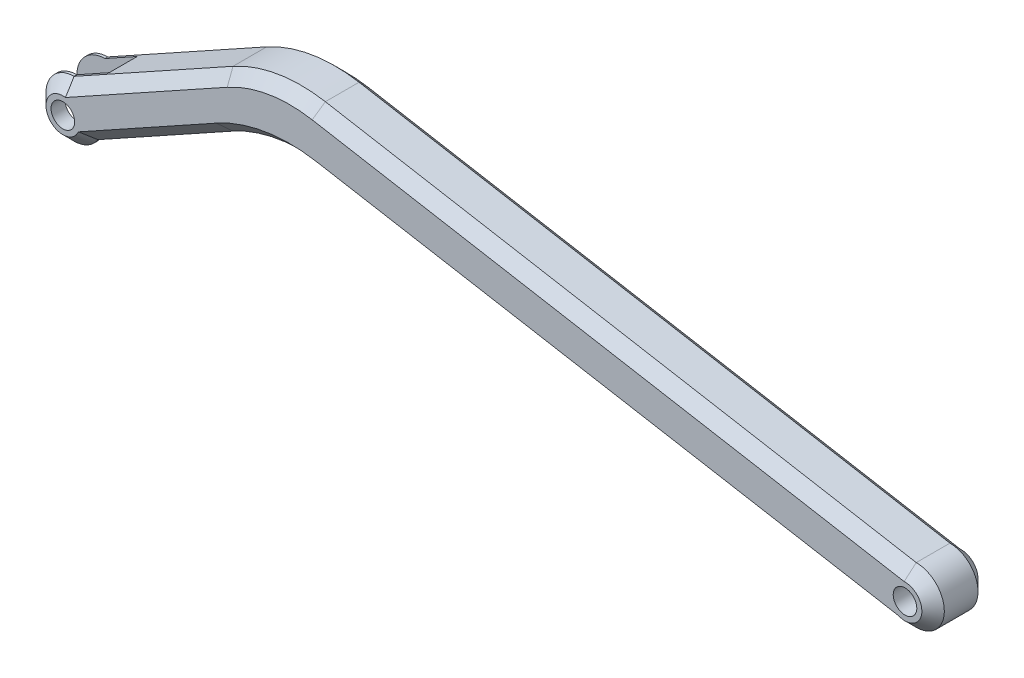
ISO-10303-21;
HEADER;
FILE_DESCRIPTION(('STEP AP214'),'2;1');
FILE_NAME('part.step','',(''),(''),'','','');
FILE_SCHEMA(('AUTOMOTIVE_DESIGN { 1 0 10303 214 1 1 1 1 }'));
ENDSEC;
DATA;
#1=APPLICATION_CONTEXT('core data for automotive mechanical design processes');
#2=APPLICATION_PROTOCOL_DEFINITION('international standard','automotive_design',2000,#1);
#3=PRODUCT_CONTEXT('',#1,'mechanical');
#4=PRODUCT('Part','Part','',(#3));
#5=PRODUCT_RELATED_PRODUCT_CATEGORY('part','',(#4));
#6=PRODUCT_DEFINITION_FORMATION('','',#4);
#7=PRODUCT_DEFINITION_CONTEXT('part definition',#1,'design');
#8=PRODUCT_DEFINITION('design','',#6,#7);
#9=PRODUCT_DEFINITION_SHAPE('','',#8);
#10=(LENGTH_UNIT() NAMED_UNIT(*) SI_UNIT(.MILLI.,.METRE.));
#11=(NAMED_UNIT(*) PLANE_ANGLE_UNIT() SI_UNIT($,.RADIAN.));
#12=(NAMED_UNIT(*) SI_UNIT($,.STERADIAN.) SOLID_ANGLE_UNIT());
#13=UNCERTAINTY_MEASURE_WITH_UNIT(LENGTH_MEASURE(1.E-05),#10,'distance_accuracy_value','');
#14=(GEOMETRIC_REPRESENTATION_CONTEXT(3) GLOBAL_UNCERTAINTY_ASSIGNED_CONTEXT((#13)) GLOBAL_UNIT_ASSIGNED_CONTEXT((#10,
#11,#12)) REPRESENTATION_CONTEXT('',''));
#15=CARTESIAN_POINT('',(0.,0.,0.));
#16=DIRECTION('',(0.,0.,1.));
#17=DIRECTION('',(1.,0.,0.));
#18=AXIS2_PLACEMENT_3D('',#15,#16,#17);
#19=CARTESIAN_POINT('',(-19.7766830177318,35.6418773630289,5.));
#20=DIRECTION('',(-0.485186186234051,0.874410867205833,0.));
#21=DIRECTION('',(-0.874410867205833,-0.485186186234051,0.));
#22=AXIS2_PLACEMENT_3D('',#19,#20,#21);
#23=PLANE('',#22);
#24=DIRECTION('',(0.,0.,-1.));
#25=VECTOR('',#24,1.);
#26=CARTESIAN_POINT('',(-75.,5.,5.));
#27=LINE('',#26,#25);
#28=CARTESIAN_POINT('',(-75.,5.,3.00000000000003));
#29=VERTEX_POINT('',#28);
#30=CARTESIAN_POINT('',(-75.,5.,2.5));
#31=VERTEX_POINT('',#30);
#32=EDGE_CURVE('E233',#29,#31,#27,.T.);
#33=ORIENTED_EDGE('',*,*,#32,.F.);
#34=DIRECTION('',(0.874410867205833,0.485186186234051,0.));
#35=VECTOR('',#34,1.);
#36=CARTESIAN_POINT('',(-19.7766830177318,35.6418773630289,3.00000000000003));
#37=LINE('',#36,#35);
#38=CARTESIAN_POINT('',(-46.6922968958502,20.7071544113314,3.00000000000003));
#39=VERTEX_POINT('',#38);
#40=EDGE_CURVE('E78',#29,#39,#37,.T.);
#41=ORIENTED_EDGE('',*,*,#40,.T.);
#42=DIRECTION('',(0.,0.,-1.));
#43=VECTOR('',#42,1.);
#44=CARTESIAN_POINT('',(-46.6922968958502,20.7071544113314,5.));
#45=LINE('',#44,#43);
#46=CARTESIAN_POINT('',(-46.6922968958502,20.7071544113314,-3.00000000000001));
#47=VERTEX_POINT('',#46);
#48=EDGE_CURVE('E235',#39,#47,#45,.T.);
#49=ORIENTED_EDGE('',*,*,#48,.T.);
#50=DIRECTION('',(-0.874410867205833,-0.485186186234051,0.));
#51=VECTOR('',#50,1.);
#52=CARTESIAN_POINT('',(-75.,5.,-3.00000000000001));
#53=LINE('',#52,#51);
#54=CARTESIAN_POINT('',(-75.,5.,-3.00000000000001));
#55=VERTEX_POINT('',#54);
#56=EDGE_CURVE('E263',#47,#55,#53,.T.);
#57=ORIENTED_EDGE('',*,*,#56,.T.);
#58=CARTESIAN_POINT('',(-75.,5.,-2.5));
#59=VERTEX_POINT('',#58);
#60=EDGE_CURVE('E214',#59,#55,#27,.T.);
#61=ORIENTED_EDGE('',*,*,#60,.F.);
#62=DIRECTION('',(-0.874410867205833,-0.485186186234051,0.));
#63=VECTOR('',#62,1.);
#64=CARTESIAN_POINT('',(-19.7766830177318,35.6418773630289,-2.5));
#65=LINE('',#64,#63);
#66=CARTESIAN_POINT('',(-69.2515625644536,8.18964749954475,-2.5));
#67=VERTEX_POINT('',#66);
#68=EDGE_CURVE('E203',#67,#59,#65,.T.);
#69=ORIENTED_EDGE('',*,*,#68,.F.);
#70=DIRECTION('',(0.,0.,-1.));
#71=VECTOR('',#70,1.);
#72=CARTESIAN_POINT('',(-69.2515625644536,8.18964749954475,5.));
#73=LINE('',#72,#71);
#74=CARTESIAN_POINT('',(-69.2515625644535,8.18964749954475,2.5));
#75=VERTEX_POINT('',#74);
#76=EDGE_CURVE('E193',#75,#67,#73,.T.);
#77=ORIENTED_EDGE('',*,*,#76,.F.);
#78=DIRECTION('',(-0.874410867205833,-0.485186186234051,0.));
#79=VECTOR('',#78,1.);
#80=CARTESIAN_POINT('',(-19.7766830177318,35.6418773630289,2.5));
#81=LINE('',#80,#79);
#82=EDGE_CURVE('E222',#75,#31,#81,.T.);
#83=ORIENTED_EDGE('',*,*,#82,.T.);
#84=EDGE_LOOP('',(#33,#41,#49,#57,#61,#69,#77,#83));
#85=FACE_BOUND('',#84,.T.);
#86=ADVANCED_FACE('F47',(#85),#23,.T.);
#87=CARTESIAN_POINT('',(-75.,0.,5.));
#88=DIRECTION('',(0.,0.,-1.));
#89=DIRECTION('',(-1.,0.,0.));
#90=AXIS2_PLACEMENT_3D('',#87,#88,#89);
#91=CYLINDRICAL_SURFACE('',#90,5.);
#92=DIRECTION('',(0.,0.,-1.));
#93=VECTOR('',#92,1.);
#94=CARTESIAN_POINT('',(-70.757479261388,-2.64594364687661,5.));
#95=LINE('',#94,#93);
#96=CARTESIAN_POINT('',(-70.757479261388,-2.64594364687661,3.00000000000003));
#97=VERTEX_POINT('',#96);
#98=CARTESIAN_POINT('',(-70.757479261388,-2.64594364687662,2.5));
#99=VERTEX_POINT('',#98);
#100=EDGE_CURVE('E231',#97,#99,#95,.T.);
#101=ORIENTED_EDGE('',*,*,#100,.F.);
#102=CARTESIAN_POINT('',(-75.,0.,3.00000000000003));
#103=DIRECTION('',(0.,0.,1.));
#104=DIRECTION('',(1.,0.,0.));
#105=AXIS2_PLACEMENT_3D('',#102,#103,#104);
#106=CIRCLE('',#105,5.);
#107=EDGE_CURVE('E485',#97,#29,#106,.F.);
#108=ORIENTED_EDGE('',*,*,#107,.T.);
#109=ORIENTED_EDGE('',*,*,#32,.T.);
#110=CARTESIAN_POINT('',(-75.,0.,2.5));
#111=DIRECTION('',(0.,0.,-1.));
#112=DIRECTION('',(-1.,0.,0.));
#113=AXIS2_PLACEMENT_3D('',#110,#111,#112);
#114=CIRCLE('',#113,5.);
#115=EDGE_CURVE('E202',#99,#31,#114,.T.);
#116=ORIENTED_EDGE('',*,*,#115,.F.);
#117=EDGE_LOOP('',(#101,#108,#109,#116));
#118=FACE_BOUND('',#117,.T.);
#119=ADVANCED_FACE('F491',(#118),#91,.T.);
#120=CARTESIAN_POINT('',(-15.5341622791197,27.9959337161523,5.));
#121=DIRECTION('',(-0.485186186234052,0.874410867205833,0.));
#122=DIRECTION('',(-0.874410867205833,-0.485186186234052,0.));
#123=AXIS2_PLACEMENT_3D('',#120,#121,#122);
#124=PLANE('',#123);
#125=DIRECTION('',(0.,0.,-1.));
#126=VECTOR('',#125,1.);
#127=CARTESIAN_POINT('',(-46.6922968958502,10.7071544113314,5.));
#128=LINE('',#127,#126);
#129=CARTESIAN_POINT('',(-46.6922968958502,10.7071544113314,3.00000000000003));
#130=VERTEX_POINT('',#129);
#131=CARTESIAN_POINT('',(-46.6922968958502,10.7071544113314,-3.00000000000001));
#132=VERTEX_POINT('',#131);
#133=EDGE_CURVE('E227',#130,#132,#128,.T.);
#134=ORIENTED_EDGE('',*,*,#133,.F.);
#135=DIRECTION('',(-0.874410867205833,-0.485186186234052,0.));
#136=VECTOR('',#135,1.);
#137=CARTESIAN_POINT('',(-70.7574792613879,-2.64594364687661,3.00000000000003));
#138=LINE('',#137,#136);
#139=EDGE_CURVE('E483',#130,#97,#138,.T.);
#140=ORIENTED_EDGE('',*,*,#139,.T.);
#141=ORIENTED_EDGE('',*,*,#100,.T.);
#142=DIRECTION('',(-0.874410867205833,-0.485186186234052,0.));
#143=VECTOR('',#142,1.);
#144=CARTESIAN_POINT('',(-15.5341622791197,27.9959337161523,2.5));
#145=LINE('',#144,#143);
#146=CARTESIAN_POINT('',(-65.0090418258415,0.543703852668149,2.5));
#147=VERTEX_POINT('',#146);
#148=EDGE_CURVE('E463',#147,#99,#145,.T.);
#149=ORIENTED_EDGE('',*,*,#148,.F.);
#150=DIRECTION('',(0.,0.,-1.));
#151=VECTOR('',#150,1.);
#152=CARTESIAN_POINT('',(-65.0090418258415,0.54370385266814,5.));
#153=LINE('',#152,#151);
#154=CARTESIAN_POINT('',(-65.0090418258415,0.543703852668144,-2.5));
#155=VERTEX_POINT('',#154);
#156=EDGE_CURVE('E631',#147,#155,#153,.T.);
#157=ORIENTED_EDGE('',*,*,#156,.T.);
#158=DIRECTION('',(-0.874410867205833,-0.485186186234052,0.));
#159=VECTOR('',#158,1.);
#160=CARTESIAN_POINT('',(-15.5341622791197,27.9959337161523,-2.5));
#161=LINE('',#160,#159);
#162=CARTESIAN_POINT('',(-70.757479261388,-2.64594364687661,-2.5));
#163=VERTEX_POINT('',#162);
#164=EDGE_CURVE('E209',#155,#163,#161,.T.);
#165=ORIENTED_EDGE('',*,*,#164,.T.);
#166=CARTESIAN_POINT('',(-70.757479261388,-2.64594364687661,-3.00000000000001));
#167=VERTEX_POINT('',#166);
#168=EDGE_CURVE('E230',#163,#167,#95,.T.);
#169=ORIENTED_EDGE('',*,*,#168,.T.);
#170=DIRECTION('',(0.874410867205833,0.485186186234052,0.));
#171=VECTOR('',#170,1.);
#172=CARTESIAN_POINT('',(-15.5341622791197,27.9959337161523,-3.00000000000001));
#173=LINE('',#172,#171);
#174=EDGE_CURVE('E280',#167,#132,#173,.T.);
#175=ORIENTED_EDGE('',*,*,#174,.T.);
#176=EDGE_LOOP('',(#134,#140,#141,#149,#157,#165,#169,#175));
#177=FACE_BOUND('',#176,.T.);
#178=ADVANCED_FACE('F577',(#177),#124,.F.);
#179=CARTESIAN_POINT('',(1.38985393390014,7.91908590447998,5.));
#180=DIRECTION('',(-0.172864709780784,-0.984945578249075,0.));
#181=DIRECTION('',(0.984945578249075,-0.172864709780784,0.));
#182=AXIS2_PLACEMENT_3D('',#179,#180,#181);
#183=PLANE('',#182);
#184=DIRECTION('',(0.,0.,-1.));
#185=VECTOR('',#184,1.);
#186=CARTESIAN_POINT('',(73.297376684661,-4.701177921124,5.));
#187=LINE('',#186,#185);
#188=CARTESIAN_POINT('',(73.297376684661,-4.701177921124,3.00000000000003));
#189=VERTEX_POINT('',#188);
#190=CARTESIAN_POINT('',(73.297376684661,-4.701177921124,-3.00000000000001));
#191=VERTEX_POINT('',#190);
#192=EDGE_CURVE('E241',#189,#191,#187,.T.);
#193=ORIENTED_EDGE('',*,*,#192,.F.);
#194=DIRECTION('',(-0.984945578249075,0.172864709780784,0.));
#195=VECTOR('',#194,1.);
#196=CARTESIAN_POINT('',(1.38985393390014,7.91908590447998,3.00000000000003));
#197=LINE('',#196,#195);
#198=CARTESIAN_POINT('',(-30.2410244954791,13.4705221874125,3.00000000000003));
#199=VERTEX_POINT('',#198);
#200=EDGE_CURVE('E479',#189,#199,#197,.T.);
#201=ORIENTED_EDGE('',*,*,#200,.T.);
#202=DIRECTION('',(0.,0.,-1.));
#203=VECTOR('',#202,1.);
#204=CARTESIAN_POINT('',(-30.2410244954791,13.4705221874125,5.));
#205=LINE('',#204,#203);
#206=CARTESIAN_POINT('',(-30.2410244954791,13.4705221874125,-3.00000000000001));
#207=VERTEX_POINT('',#206);
#208=EDGE_CURVE('E225',#199,#207,#205,.T.);
#209=ORIENTED_EDGE('',*,*,#208,.T.);
#210=DIRECTION('',(0.984945578249075,-0.172864709780784,0.));
#211=VECTOR('',#210,1.);
#212=CARTESIAN_POINT('',(73.297376684661,-4.701177921124,-3.00000000000001));
#213=LINE('',#212,#211);
#214=EDGE_CURVE('E274',#207,#191,#213,.T.);
#215=ORIENTED_EDGE('',*,*,#214,.T.);
#216=EDGE_LOOP('',(#193,#201,#209,#215));
#217=FACE_BOUND('',#216,.T.);
#218=ADVANCED_FACE('F515',(#217),#183,.T.);
#219=CARTESIAN_POINT('',(75.,0.,5.));
#220=DIRECTION('',(0.,0.,-1.));
#221=DIRECTION('',(-1.,0.,0.));
#222=AXIS2_PLACEMENT_3D('',#219,#220,#221);
#223=CYLINDRICAL_SURFACE('',#222,5.);
#224=DIRECTION('',(0.,0.,-1.));
#225=VECTOR('',#224,1.);
#226=CARTESIAN_POINT('',(75.,5.00000000000003,5.));
#227=LINE('',#226,#225);
#228=CARTESIAN_POINT('',(75.,5.00000000000003,3.00000000000003));
#229=VERTEX_POINT('',#228);
#230=CARTESIAN_POINT('',(75.,5.00000000000003,-3.00000000000001));
#231=VERTEX_POINT('',#230);
#232=EDGE_CURVE('E239',#229,#231,#227,.T.);
#233=ORIENTED_EDGE('',*,*,#232,.F.);
#234=CARTESIAN_POINT('',(75.,0.,3.00000000000003));
#235=DIRECTION('',(0.,0.,1.));
#236=DIRECTION('',(1.,0.,0.));
#237=AXIS2_PLACEMENT_3D('',#234,#235,#236);
#238=CIRCLE('',#237,5.);
#239=EDGE_CURVE('E476',#229,#189,#238,.F.);
#240=ORIENTED_EDGE('',*,*,#239,.T.);
#241=ORIENTED_EDGE('',*,*,#192,.T.);
#242=CARTESIAN_POINT('',(75.,0.,-3.00000000000001));
#243=DIRECTION('',(0.,0.,1.));
#244=DIRECTION('',(1.,0.,0.));
#245=AXIS2_PLACEMENT_3D('',#242,#243,#244);
#246=CIRCLE('',#245,5.);
#247=EDGE_CURVE('E271',#191,#231,#246,.T.);
#248=ORIENTED_EDGE('',*,*,#247,.T.);
#249=EDGE_LOOP('',(#233,#240,#241,#248));
#250=FACE_BOUND('',#249,.T.);
#251=ADVANCED_FACE('F513',(#250),#223,.T.);
#252=CARTESIAN_POINT('',(3.09247724923907,17.620263825604,5.));
#253=DIRECTION('',(-0.172864709780784,-0.984945578249075,0.));
#254=DIRECTION('',(0.984945578249075,-0.172864709780784,0.));
#255=AXIS2_PLACEMENT_3D('',#252,#253,#254);
#256=PLANE('',#255);
#257=DIRECTION('',(0.,0.,-1.));
#258=VECTOR('',#257,1.);
#259=CARTESIAN_POINT('',(-30.2410244954792,23.4705221874125,5.));
#260=LINE('',#259,#258);
#261=CARTESIAN_POINT('',(-30.2410244954792,23.4705221874125,3.00000000000003));
#262=VERTEX_POINT('',#261);
#263=CARTESIAN_POINT('',(-30.2410244954792,23.4705221874125,-3.00000000000001));
#264=VERTEX_POINT('',#263);
#265=EDGE_CURVE('E237',#262,#264,#260,.T.);
#266=ORIENTED_EDGE('',*,*,#265,.F.);
#267=DIRECTION('',(0.984945578249075,-0.172864709780784,0.));
#268=VECTOR('',#267,1.);
#269=CARTESIAN_POINT('',(75.,5.00000000000003,3.00000000000003));
#270=LINE('',#269,#268);
#271=EDGE_CURVE('E11',#262,#229,#270,.T.);
#272=ORIENTED_EDGE('',*,*,#271,.T.);
#273=ORIENTED_EDGE('',*,*,#232,.T.);
#274=DIRECTION('',(-0.984945578249075,0.172864709780784,0.));
#275=VECTOR('',#274,1.);
#276=CARTESIAN_POINT('',(3.09247724923907,17.620263825604,-3.00000000000001));
#277=LINE('',#276,#275);
#278=EDGE_CURVE('E268',#231,#264,#277,.T.);
#279=ORIENTED_EDGE('',*,*,#278,.T.);
#280=EDGE_LOOP('',(#266,#272,#273,#279));
#281=FACE_BOUND('',#280,.T.);
#282=ADVANCED_FACE('F562',(#281),#256,.F.);
#283=CARTESIAN_POINT('',(-34.5626422399989,-1.15311726881433,5.));
#284=DIRECTION('',(0.,0.,-1.));
#285=DIRECTION('',(-1.,0.,0.));
#286=AXIS2_PLACEMENT_3D('',#283,#284,#285);
#287=CYLINDRICAL_SURFACE('',#286,25.);
#288=ORIENTED_EDGE('',*,*,#48,.F.);
#289=CARTESIAN_POINT('',(-34.5626422399989,-1.15311726881433,3.00000000000003));
#290=DIRECTION('',(0.,0.,1.));
#291=DIRECTION('',(1.,0.,0.));
#292=AXIS2_PLACEMENT_3D('',#289,#290,#291);
#293=CIRCLE('',#292,25.);
#294=EDGE_CURVE('E63',#39,#262,#293,.F.);
#295=ORIENTED_EDGE('',*,*,#294,.T.);
#296=ORIENTED_EDGE('',*,*,#265,.T.);
#297=CARTESIAN_POINT('',(-34.5626422399989,-1.15311726881433,-3.00000000000001));
#298=DIRECTION('',(0.,0.,1.));
#299=DIRECTION('',(1.,0.,0.));
#300=AXIS2_PLACEMENT_3D('',#297,#298,#299);
#301=CIRCLE('',#300,25.);
#302=EDGE_CURVE('E265',#264,#47,#301,.T.);
#303=ORIENTED_EDGE('',*,*,#302,.T.);
#304=EDGE_LOOP('',(#288,#295,#296,#303));
#305=FACE_BOUND('',#304,.T.);
#306=ADVANCED_FACE('F559',(#305),#287,.T.);
#307=ORIENTED_EDGE('',*,*,#168,.F.);
#308=CARTESIAN_POINT('',(-75.,0.,-2.5));
#309=DIRECTION('',(0.,0.,-1.));
#310=DIRECTION('',(-1.,0.,0.));
#311=AXIS2_PLACEMENT_3D('',#308,#309,#310);
#312=CIRCLE('',#311,5.);
#313=EDGE_CURVE('E215',#163,#59,#312,.T.);
#314=ORIENTED_EDGE('',*,*,#313,.T.);
#315=ORIENTED_EDGE('',*,*,#60,.T.);
#316=CARTESIAN_POINT('',(-75.,0.,-3.00000000000001));
#317=DIRECTION('',(0.,0.,1.));
#318=DIRECTION('',(1.,0.,0.));
#319=AXIS2_PLACEMENT_3D('',#316,#317,#318);
#320=CIRCLE('',#319,5.);
#321=EDGE_CURVE('E243',#55,#167,#320,.T.);
#322=ORIENTED_EDGE('',*,*,#321,.T.);
#323=EDGE_LOOP('',(#307,#314,#315,#322));
#324=FACE_BOUND('',#323,.T.);
#325=ADVANCED_FACE('F558',(#324),#91,.T.);
#326=CARTESIAN_POINT('',(-34.5626422399988,-11.1531172688143,5.));
#327=DIRECTION('',(0.,0.,-1.));
#328=DIRECTION('',(-1.,0.,0.));
#329=AXIS2_PLACEMENT_3D('',#326,#327,#328);
#330=CYLINDRICAL_SURFACE('',#329,25.);
#331=ORIENTED_EDGE('',*,*,#208,.F.);
#332=CARTESIAN_POINT('',(-34.5626422399988,-11.1531172688143,3.00000000000003));
#333=DIRECTION('',(0.,0.,1.));
#334=DIRECTION('',(1.,0.,0.));
#335=AXIS2_PLACEMENT_3D('',#332,#333,#334);
#336=CIRCLE('',#335,25.);
#337=EDGE_CURVE('E481',#199,#130,#336,.T.);
#338=ORIENTED_EDGE('',*,*,#337,.T.);
#339=ORIENTED_EDGE('',*,*,#133,.T.);
#340=CARTESIAN_POINT('',(-34.5626422399988,-11.1531172688143,-3.00000000000001));
#341=DIRECTION('',(0.,0.,1.));
#342=DIRECTION('',(1.,0.,0.));
#343=AXIS2_PLACEMENT_3D('',#340,#341,#342);
#344=CIRCLE('',#343,25.);
#345=EDGE_CURVE('E277',#132,#207,#344,.F.);
#346=ORIENTED_EDGE('',*,*,#345,.T.);
#347=EDGE_LOOP('',(#331,#338,#339,#346));
#348=FACE_BOUND('',#347,.T.);
#349=ADVANCED_FACE('F581',(#348),#330,.F.);
#350=CARTESIAN_POINT('',(0.,0.,5.));
#351=DIRECTION('',(0.,0.,1.));
#352=DIRECTION('',(1.,0.,0.));
#353=AXIS2_PLACEMENT_3D('',#350,#351,#352);
#354=PLANE('',#353);
#355=DIRECTION('',(0.984945578249075,-0.172864709780784,0.));
#356=VECTOR('',#355,1.);
#357=CARTESIAN_POINT('',(1.73558335346171,9.8889770609781,5.));
#358=LINE('',#357,#356);
#359=CARTESIAN_POINT('',(-29.8952950759175,15.4404133439107,5.));
#360=VERTEX_POINT('',#359);
#361=CARTESIAN_POINT('',(73.8366637876181,-2.7652574666676,5.));
#362=VERTEX_POINT('',#361);
#363=EDGE_CURVE('E472',#360,#362,#358,.T.);
#364=ORIENTED_EDGE('',*,*,#363,.T.);
#365=CARTESIAN_POINT('',(75.,0.,5.));
#366=DIRECTION('',(0.,0.,1.));
#367=DIRECTION('',(1.,0.,0.));
#368=AXIS2_PLACEMENT_3D('',#365,#366,#367);
#369=CIRCLE('',#368,3.00000000000003);
#370=CARTESIAN_POINT('',(74.8478282638338,2.99613814146019,5.));
#371=VERTEX_POINT('',#370);
#372=EDGE_CURVE('E474',#362,#371,#369,.T.);
#373=ORIENTED_EDGE('',*,*,#372,.T.);
#374=DIRECTION('',(-0.984945578249075,0.172864709780784,0.));
#375=VECTOR('',#374,1.);
#376=CARTESIAN_POINT('',(-30.5867539150407,21.5006310309144,5.));
#377=LINE('',#376,#375);
#378=CARTESIAN_POINT('',(-30.5867539150407,21.5006310309144,5.));
#379=VERTEX_POINT('',#378);
#380=EDGE_CURVE('E452',#371,#379,#377,.T.);
#381=ORIENTED_EDGE('',*,*,#380,.T.);
#382=CARTESIAN_POINT('',(-34.5626422399989,-1.15311726881433,5.));
#383=DIRECTION('',(0.,0.,1.));
#384=DIRECTION('',(1.,0.,0.));
#385=AXIS2_PLACEMENT_3D('',#382,#383,#384);
#386=CIRCLE('',#385,23.);
#387=CARTESIAN_POINT('',(-45.7219245233821,18.9583326769198,5.));
#388=VERTEX_POINT('',#387);
#389=EDGE_CURVE('E455',#379,#388,#386,.T.);
#390=ORIENTED_EDGE('',*,*,#389,.T.);
#391=DIRECTION('',(-0.874410867205833,-0.485186186234051,0.));
#392=VECTOR('',#391,1.);
#393=CARTESIAN_POINT('',(-18.8063106452637,33.8930556286172,5.));
#394=LINE('',#393,#392);
#395=CARTESIAN_POINT('',(-74.5448834232517,2.96527720484429,5.));
#396=VERTEX_POINT('',#395);
#397=EDGE_CURVE('E459',#388,#396,#394,.T.);
#398=ORIENTED_EDGE('',*,*,#397,.T.);
#399=CARTESIAN_POINT('',(-75.,0.,5.));
#400=DIRECTION('',(0.,0.,1.));
#401=DIRECTION('',(1.,0.,0.));
#402=AXIS2_PLACEMENT_3D('',#399,#400,#401);
#403=CIRCLE('',#402,3.00000000000003);
#404=CARTESIAN_POINT('',(-72.2431074295759,-1.18302297320905,5.));
#405=VERTEX_POINT('',#404);
#406=EDGE_CURVE('E461',#396,#405,#403,.T.);
#407=ORIENTED_EDGE('',*,*,#406,.T.);
#408=DIRECTION('',(0.874410867205833,0.485186186234052,0.));
#409=VECTOR('',#408,1.);
#410=CARTESIAN_POINT('',(-47.6626692683183,12.4559761457431,5.));
#411=LINE('',#410,#409);
#412=CARTESIAN_POINT('',(-47.6626692683183,12.4559761457431,5.));
#413=VERTEX_POINT('',#412);
#414=EDGE_CURVE('E468',#405,#413,#411,.T.);
#415=ORIENTED_EDGE('',*,*,#414,.T.);
#416=CARTESIAN_POINT('',(-34.5626422399988,-11.1531172688143,5.));
#417=DIRECTION('',(0.,0.,1.));
#418=DIRECTION('',(1.,0.,0.));
#419=AXIS2_PLACEMENT_3D('',#416,#417,#418);
#420=CIRCLE('',#419,27.);
#421=EDGE_CURVE('E470',#413,#360,#420,.F.);
#422=ORIENTED_EDGE('',*,*,#421,.T.);
#423=EDGE_LOOP('',(#364,#373,#381,#390,#398,#407,#415,#422));
#424=FACE_BOUND('',#423,.T.);
#425=CARTESIAN_POINT('',(-75.,0.,5.));
#426=DIRECTION('',(0.,0.,1.));
#427=DIRECTION('',(1.,0.,0.));
#428=AXIS2_PLACEMENT_3D('',#425,#426,#427);
#429=CIRCLE('',#428,2.1);
#430=CARTESIAN_POINT('',(-72.9,0.,5.));
#431=VERTEX_POINT('',#430);
#432=EDGE_CURVE('E616',#431,#431,#429,.T.);
#433=ORIENTED_EDGE('',*,*,#432,.F.);
#434=EDGE_LOOP('',(#433));
#435=FACE_BOUND('',#434,.T.);
#436=CARTESIAN_POINT('',(75.,0.,5.));
#437=DIRECTION('',(0.,0.,1.));
#438=DIRECTION('',(1.,0.,0.));
#439=AXIS2_PLACEMENT_3D('',#436,#437,#438);
#440=CIRCLE('',#439,2.1);
#441=CARTESIAN_POINT('',(77.1,0.,5.));
#442=VERTEX_POINT('',#441);
#443=EDGE_CURVE('E618',#442,#442,#440,.T.);
#444=ORIENTED_EDGE('',*,*,#443,.F.);
#445=EDGE_LOOP('',(#444));
#446=FACE_BOUND('',#445,.T.);
#447=ADVANCED_FACE('F498',(#424,#435,#446),#354,.T.);
#448=CARTESIAN_POINT('',(0.,0.,-5.));
#449=DIRECTION('',(0.,0.,1.));
#450=DIRECTION('',(1.,0.,0.));
#451=AXIS2_PLACEMENT_3D('',#448,#449,#450);
#452=PLANE('',#451);
#453=CARTESIAN_POINT('',(-75.,0.,-5.));
#454=DIRECTION('',(0.,0.,1.));
#455=DIRECTION('',(1.,0.,0.));
#456=AXIS2_PLACEMENT_3D('',#453,#454,#455);
#457=CIRCLE('',#456,2.1);
#458=CARTESIAN_POINT('',(-72.9,0.,-5.));
#459=VERTEX_POINT('',#458);
#460=EDGE_CURVE('E617',#459,#459,#457,.T.);
#461=ORIENTED_EDGE('',*,*,#460,.T.);
#462=EDGE_LOOP('',(#461));
#463=FACE_BOUND('',#462,.T.);
#464=CARTESIAN_POINT('',(75.,0.,-5.));
#465=DIRECTION('',(0.,0.,1.));
#466=DIRECTION('',(1.,0.,0.));
#467=AXIS2_PLACEMENT_3D('',#464,#465,#466);
#468=CIRCLE('',#467,2.1);
#469=CARTESIAN_POINT('',(77.1,0.,-5.));
#470=VERTEX_POINT('',#469);
#471=EDGE_CURVE('E504',#470,#470,#468,.T.);
#472=ORIENTED_EDGE('',*,*,#471,.T.);
#473=EDGE_LOOP('',(#472));
#474=FACE_BOUND('',#473,.T.);
#475=DIRECTION('',(-0.874410867205833,-0.485186186234052,0.));
#476=VECTOR('',#475,1.);
#477=CARTESIAN_POINT('',(-16.5045346515878,29.7447554505639,-5.));
#478=LINE('',#477,#476);
#479=CARTESIAN_POINT('',(-47.6626692683183,12.4559761457431,-5.));
#480=VERTEX_POINT('',#479);
#481=CARTESIAN_POINT('',(-72.2431074295759,-1.18302297320902,-5.));
#482=VERTEX_POINT('',#481);
#483=EDGE_CURVE('E246',#480,#482,#478,.T.);
#484=ORIENTED_EDGE('',*,*,#483,.T.);
#485=CARTESIAN_POINT('',(-75.,0.,-5.));
#486=DIRECTION('',(0.,0.,1.));
#487=DIRECTION('',(1.,0.,0.));
#488=AXIS2_PLACEMENT_3D('',#485,#486,#487);
#489=CIRCLE('',#488,3.00000000000001);
#490=CARTESIAN_POINT('',(-74.5448834232517,2.96527720484426,-5.));
#491=VERTEX_POINT('',#490);
#492=EDGE_CURVE('E260',#482,#491,#489,.F.);
#493=ORIENTED_EDGE('',*,*,#492,.T.);
#494=DIRECTION('',(0.874410867205833,0.485186186234051,0.));
#495=VECTOR('',#494,1.);
#496=CARTESIAN_POINT('',(-45.7219245233821,18.9583326769198,-5.));
#497=LINE('',#496,#495);
#498=CARTESIAN_POINT('',(-45.7219245233821,18.9583326769198,-5.));
#499=VERTEX_POINT('',#498);
#500=EDGE_CURVE('E258',#491,#499,#497,.T.);
#501=ORIENTED_EDGE('',*,*,#500,.T.);
#502=CARTESIAN_POINT('',(-34.5626422399989,-1.15311726881433,-5.));
#503=DIRECTION('',(0.,0.,1.));
#504=DIRECTION('',(1.,0.,0.));
#505=AXIS2_PLACEMENT_3D('',#502,#503,#504);
#506=CIRCLE('',#505,23.);
#507=CARTESIAN_POINT('',(-30.5867539150407,21.5006310309144,-5.));
#508=VERTEX_POINT('',#507);
#509=EDGE_CURVE('E256',#499,#508,#506,.F.);
#510=ORIENTED_EDGE('',*,*,#509,.T.);
#511=DIRECTION('',(0.984945578249075,-0.172864709780784,0.));
#512=VECTOR('',#511,1.);
#513=CARTESIAN_POINT('',(2.74674782967751,15.6503726691059,-5.));
#514=LINE('',#513,#512);
#515=CARTESIAN_POINT('',(74.8478282638339,2.99613814146017,-5.));
#516=VERTEX_POINT('',#515);
#517=EDGE_CURVE('E254',#508,#516,#514,.T.);
#518=ORIENTED_EDGE('',*,*,#517,.T.);
#519=CARTESIAN_POINT('',(75.,0.,-5.));
#520=DIRECTION('',(0.,0.,1.));
#521=DIRECTION('',(1.,0.,0.));
#522=AXIS2_PLACEMENT_3D('',#519,#520,#521);
#523=CIRCLE('',#522,3.);
#524=CARTESIAN_POINT('',(73.8366637876181,-2.76525746666757,-5.));
#525=VERTEX_POINT('',#524);
#526=EDGE_CURVE('E252',#516,#525,#523,.F.);
#527=ORIENTED_EDGE('',*,*,#526,.T.);
#528=DIRECTION('',(-0.984945578249075,0.172864709780784,0.));
#529=VECTOR('',#528,1.);
#530=CARTESIAN_POINT('',(-29.8952950759175,15.4404133439107,-5.));
#531=LINE('',#530,#529);
#532=CARTESIAN_POINT('',(-29.8952950759175,15.4404133439107,-5.));
#533=VERTEX_POINT('',#532);
#534=EDGE_CURVE('E250',#525,#533,#531,.T.);
#535=ORIENTED_EDGE('',*,*,#534,.T.);
#536=CARTESIAN_POINT('',(-34.5626422399988,-11.1531172688143,-5.));
#537=DIRECTION('',(0.,0.,1.));
#538=DIRECTION('',(1.,0.,0.));
#539=AXIS2_PLACEMENT_3D('',#536,#537,#538);
#540=CIRCLE('',#539,27.);
#541=EDGE_CURVE('E248',#533,#480,#540,.T.);
#542=ORIENTED_EDGE('',*,*,#541,.T.);
#543=EDGE_LOOP('',(#484,#493,#501,#510,#518,#527,#535,#542));
#544=FACE_BOUND('',#543,.T.);
#545=ADVANCED_FACE('F341',(#463,#474,#544),#452,.F.);
#546=CARTESIAN_POINT('',(75.,0.,-3.00000000000001));
#547=DIRECTION('',(0.,0.,1.));
#548=DIRECTION('',(1.,0.,0.));
#549=AXIS2_PLACEMENT_3D('',#546,#547,#548);
#550=CONICAL_SURFACE('',#549,5.,0.785398163397452);
#551=CARTESIAN_POINT('',(73.8366637876181,-2.76525746666757,-5.));
#552=CARTESIAN_POINT('',(73.7894011421171,-2.92605490443728,-4.83345323117694));
#553=CARTESIAN_POINT('',(73.7428706962458,-3.08702268315188,-4.6668652572699));
#554=CARTESIAN_POINT('',(73.6510359063852,-3.40923671797686,-4.33362697412222));
#555=CARTESIAN_POINT('',(73.6057315382489,-3.57048296853623,-4.16697666617485));
#556=CARTESIAN_POINT('',(73.5161092837704,-3.89319620795016,-3.83362916296133));
#557=CARTESIAN_POINT('',(73.4717913859556,-4.05466319421439,-3.66693196826333));
#558=CARTESIAN_POINT('',(73.3839928290359,-4.37778747637597,-3.33349486326228));
#559=CARTESIAN_POINT('',(73.3405121863303,-4.53944477593534,-3.16675495218722));
#560=CARTESIAN_POINT('',(73.297376684661,-4.701177921124,-3.00000000000001));
#561=B_SPLINE_CURVE_WITH_KNOTS('',3,(#551,#552,#553,#554,#555,#556,#557,#558,#559,#560),
.UNSPECIFIED.,.F.,.F.,(4,2,2,2,4),(0.,0.708831333942177,1.417648697562,2.12645781337638,
2.83528079860437),.UNSPECIFIED.);
#562=EDGE_CURVE('E347',#525,#191,#561,.T.);
#563=ORIENTED_EDGE('',*,*,#562,.F.);
#564=ORIENTED_EDGE('',*,*,#526,.F.);
#565=CARTESIAN_POINT('',(74.8478282638339,2.99613814146017,-5.));
#566=CARTESIAN_POINT('',(74.8581457360479,3.16341971073835,-4.83345323117694));
#567=CARTESIAN_POINT('',(74.8692096537014,3.33061210860216,-4.6668652572699));
#568=CARTESIAN_POINT('',(74.8925851420493,3.66484122075642,-4.33362697412222));
#569=CARTESIAN_POINT('',(74.9048966881493,3.83187793805028,-4.16697666617485));
#570=CARTESIAN_POINT('',(74.9305224724691,4.1658229972574,-3.83362916296133));
#571=CARTESIAN_POINT('',(74.9438366990198,4.33273134064182,-3.66693196826333));
#572=CARTESIAN_POINT('',(74.9713171588724,4.66644186287016,-3.33349486326228));
#573=CARTESIAN_POINT('',(74.9854834088406,4.83324403957283,-3.16675495218723));
#574=CARTESIAN_POINT('',(74.9999999999999,5.00000000000003,-3.00000000000001));
#575=B_SPLINE_CURVE_WITH_KNOTS('',3,(#565,#566,#567,#568,#569,#570,#571,#572,#573,#574),
.UNSPECIFIED.,.F.,.F.,(4,2,2,2,4),(0.,0.708831333942177,1.417648697562,2.12645781337638,
2.83528079860436),.UNSPECIFIED.);
#576=EDGE_CURVE('E228',#231,#516,#575,.F.);
#577=ORIENTED_EDGE('',*,*,#576,.F.);
#578=ORIENTED_EDGE('',*,*,#247,.F.);
#579=EDGE_LOOP('',(#563,#564,#577,#578));
#580=FACE_BOUND('',#579,.T.);
#581=ADVANCED_FACE('F333',(#580),#550,.T.);
#582=CARTESIAN_POINT('',(3.09247724923907,17.620263825604,-3.00000000000001));
#583=DIRECTION('',(-0.122233808513837,-0.696461697479624,0.70710678118655));
#584=DIRECTION('',(-0.984945578249075,0.172864709780784,0.));
#585=AXIS2_PLACEMENT_3D('',#582,#583,#584);
#586=PLANE('',#585);
#587=ORIENTED_EDGE('',*,*,#576,.T.);
#588=ORIENTED_EDGE('',*,*,#517,.F.);
#589=DIRECTION('',(-0.12223380851384,-0.696461697479627,-0.707106781186546));
#590=VECTOR('',#589,1.);
#591=CARTESIAN_POINT('',(-30.2410244954792,23.4705221874125,-3.00000000000001));
#592=LINE('',#591,#590);
#593=EDGE_CURVE('E528',#264,#508,#592,.T.);
#594=ORIENTED_EDGE('',*,*,#593,.F.);
#595=ORIENTED_EDGE('',*,*,#278,.F.);
#596=EDGE_LOOP('',(#587,#588,#594,#595));
#597=FACE_BOUND('',#596,.T.);
#598=ADVANCED_FACE('F340',(#597),#586,.F.);
#599=CARTESIAN_POINT('',(1.73558335346171,9.88897706097813,-5.));
#600=DIRECTION('',(-0.122233808513836,-0.696461697479624,-0.70710678118655));
#601=DIRECTION('',(0.984945578249075,-0.172864709780784,0.));
#602=AXIS2_PLACEMENT_3D('',#599,#600,#601);
#603=PLANE('',#602);
#604=ORIENTED_EDGE('',*,*,#562,.T.);
#605=ORIENTED_EDGE('',*,*,#214,.F.);
#606=DIRECTION('',(-0.122233808513837,-0.696461697479628,0.707106781186545));
#607=VECTOR('',#606,1.);
#608=CARTESIAN_POINT('',(-29.8952950759175,15.4404133439107,-5.));
#609=LINE('',#608,#607);
#610=EDGE_CURVE('E530',#533,#207,#609,.T.);
#611=ORIENTED_EDGE('',*,*,#610,.F.);
#612=ORIENTED_EDGE('',*,*,#534,.F.);
#613=EDGE_LOOP('',(#604,#605,#611,#612));
#614=FACE_BOUND('',#613,.T.);
#615=ADVANCED_FACE('F331',(#614),#603,.T.);
#616=CARTESIAN_POINT('',(-34.5626422399989,-1.15311726881433,-3.00000000000001));
#617=DIRECTION('',(0.,0.,1.));
#618=DIRECTION('',(1.,0.,0.));
#619=AXIS2_PLACEMENT_3D('',#616,#617,#618);
#620=CONICAL_SURFACE('',#619,25.,0.785398163397452);
#621=ORIENTED_EDGE('',*,*,#593,.T.);
#622=ORIENTED_EDGE('',*,*,#509,.F.);
#623=DIRECTION('',(0.343078442424138,-0.618301853744456,-0.707106781186546));
#624=VECTOR('',#623,1.);
#625=CARTESIAN_POINT('',(-46.6922968958502,20.7071544113314,-3.00000000000001));
#626=LINE('',#625,#624);
#627=EDGE_CURVE('E534',#47,#499,#626,.T.);
#628=ORIENTED_EDGE('',*,*,#627,.F.);
#629=ORIENTED_EDGE('',*,*,#302,.F.);
#630=EDGE_LOOP('',(#621,#622,#628,#629));
#631=FACE_BOUND('',#630,.T.);
#632=ADVANCED_FACE('F324',(#631),#620,.T.);
#633=CARTESIAN_POINT('',(-34.5626422399988,-11.1531172688143,-5.));
#634=DIRECTION('',(0.,0.,-1.));
#635=DIRECTION('',(-1.,0.,0.));
#636=AXIS2_PLACEMENT_3D('',#633,#634,#635);
#637=CONICAL_SURFACE('',#636,27.,0.785398163397451);
#638=ORIENTED_EDGE('',*,*,#610,.T.);
#639=ORIENTED_EDGE('',*,*,#345,.F.);
#640=DIRECTION('',(0.34307844242414,-0.618301853744455,0.707106781186545));
#641=VECTOR('',#640,1.);
#642=CARTESIAN_POINT('',(-47.6626692683183,12.4559761457431,-5.));
#643=LINE('',#642,#641);
#644=EDGE_CURVE('E538',#480,#132,#643,.T.);
#645=ORIENTED_EDGE('',*,*,#644,.F.);
#646=ORIENTED_EDGE('',*,*,#541,.F.);
#647=EDGE_LOOP('',(#638,#639,#645,#646));
#648=FACE_BOUND('',#647,.T.);
#649=ADVANCED_FACE('F317',(#648),#637,.F.);
#650=CARTESIAN_POINT('',(-18.8063106452637,33.8930556286172,-5.));
#651=DIRECTION('',(-0.343078442424136,0.618301853744453,-0.707106781186549));
#652=DIRECTION('',(-0.874410867205833,-0.485186186234051,0.));
#653=AXIS2_PLACEMENT_3D('',#650,#651,#652);
#654=PLANE('',#653);
#655=ORIENTED_EDGE('',*,*,#627,.T.);
#656=ORIENTED_EDGE('',*,*,#500,.F.);
#657=CARTESIAN_POINT('',(-74.5448834232517,2.96527720484426,-5.));
#658=CARTESIAN_POINT('',(-74.5757657380374,3.13745859652231,-4.83445904745315));
#659=CARTESIAN_POINT('',(-74.6088965914862,3.30883926555064,-4.6685272955943));
#660=CARTESIAN_POINT('',(-74.6788821124341,3.65020468079884,-4.33607765881274));
#661=CARTESIAN_POINT('',(-74.7157360678547,3.820189687253,-4.16955989182897));
#662=CARTESIAN_POINT('',(-74.7924025565843,4.15901563571867,-3.83608927912061));
#663=CARTESIAN_POINT('',(-74.8322147537737,4.32785670533437,-3.66913648489806));
#664=CARTESIAN_POINT('',(-74.9143451668689,4.66460112445283,-3.33483496344646));
#665=CARTESIAN_POINT('',(-74.9566638560448,4.83250429027124,-3.16748616720893));
#666=CARTESIAN_POINT('',(-75.,5.00000000000001,-3.00000000000001));
#667=B_SPLINE_CURVE_WITH_KNOTS('',3,(#657,#658,#659,#660,#661,#662,#663,#664,#665,#666),
.UNSPECIFIED.,.F.,.F.,(4,2,2,2,4),(0.,0.722485912396871,1.44483390319965,2.16709994496418,
2.88950280080791),.UNSPECIFIED.);
#668=EDGE_CURVE('E291',#55,#491,#667,.F.);
#669=ORIENTED_EDGE('',*,*,#668,.F.);
#670=ORIENTED_EDGE('',*,*,#56,.F.);
#671=EDGE_LOOP('',(#655,#656,#669,#670));
#672=FACE_BOUND('',#671,.T.);
#673=ADVANCED_FACE('F309',(#672),#654,.T.);
#674=CARTESIAN_POINT('',(-15.5341622791197,27.9959337161523,-3.00000000000001));
#675=DIRECTION('',(-0.343078442424136,0.618301853744452,0.70710678118655));
#676=DIRECTION('',(0.874410867205833,0.485186186234052,0.));
#677=AXIS2_PLACEMENT_3D('',#674,#675,#676);
#678=PLANE('',#677);
#679=ORIENTED_EDGE('',*,*,#644,.T.);
#680=ORIENTED_EDGE('',*,*,#174,.F.);
#681=CARTESIAN_POINT('',(-70.757479261388,-2.64594364687661,-3.00000000000001));
#682=CARTESIAN_POINT('',(-70.8766670668628,-2.52053590717713,-3.16748616720893));
#683=CARTESIAN_POINT('',(-70.9967390261217,-2.3957758609077,-3.33483496344646));
#684=CARTESIAN_POINT('',(-71.2390055735171,-2.14788651346472,-3.66913648489806));
#685=CARTESIAN_POINT('',(-71.3611997553476,-2.02475690792326,-3.83608927912062));
#686=CARTESIAN_POINT('',(-71.6081239362203,-1.78040220109697,-4.16955989182897));
#687=CARTESIAN_POINT('',(-71.7328542214057,-1.65917731748423,-4.33607765881273));
#688=CARTESIAN_POINT('',(-71.9854686432277,-1.41914758233155,-4.66852729559429));
#689=CARTESIAN_POINT('',(-72.113353377498,-1.30034319728011,-4.83445904745315));
#690=CARTESIAN_POINT('',(-72.2431074295759,-1.18302297320902,-5.));
#691=B_SPLINE_CURVE_WITH_KNOTS('',3,(#681,#682,#683,#684,#685,#686,#687,#688,#689,#690),
.UNSPECIFIED.,.F.,.F.,(4,2,2,2,4),(0.,0.722402855843725,1.44466889760825,2.16701688841102,
2.88950280080791),.UNSPECIFIED.);
#692=EDGE_CURVE('E224',#482,#167,#691,.F.);
#693=ORIENTED_EDGE('',*,*,#692,.F.);
#694=ORIENTED_EDGE('',*,*,#483,.F.);
#695=EDGE_LOOP('',(#679,#680,#693,#694));
#696=FACE_BOUND('',#695,.T.);
#697=ADVANCED_FACE('F303',(#696),#678,.F.);
#698=CARTESIAN_POINT('',(-75.,0.,-3.00000000000001));
#699=DIRECTION('',(0.,0.,1.));
#700=DIRECTION('',(1.,0.,0.));
#701=AXIS2_PLACEMENT_3D('',#698,#699,#700);
#702=CONICAL_SURFACE('',#701,5.,0.785398163397451);
#703=ORIENTED_EDGE('',*,*,#668,.T.);
#704=ORIENTED_EDGE('',*,*,#492,.F.);
#705=ORIENTED_EDGE('',*,*,#692,.T.);
#706=ORIENTED_EDGE('',*,*,#321,.F.);
#707=EDGE_LOOP('',(#703,#704,#705,#706));
#708=FACE_BOUND('',#707,.T.);
#709=ADVANCED_FACE('F299',(#708),#702,.T.);
#710=CARTESIAN_POINT('',(-71.1923073093898,11.6872909683681,0.));
#711=DIRECTION('',(0.874410867205833,0.485186186234051,0.));
#712=DIRECTION('',(-0.485186186234051,0.874410867205833,0.));
#713=AXIS2_PLACEMENT_3D('',#710,#711,#712);
#714=PLANE('',#713);
#715=ORIENTED_EDGE('',*,*,#76,.T.);
#716=DIRECTION('',(0.485186186234051,-0.874410867205833,0.));
#717=VECTOR('',#716,1.);
#718=CARTESIAN_POINT('',(-71.1923073093898,11.6872909683681,-2.5));
#719=LINE('',#718,#717);
#720=EDGE_CURVE('E196',#67,#155,#719,.T.);
#721=ORIENTED_EDGE('',*,*,#720,.T.);
#722=ORIENTED_EDGE('',*,*,#156,.F.);
#723=DIRECTION('',(0.485186186234051,-0.874410867205833,0.));
#724=VECTOR('',#723,1.);
#725=CARTESIAN_POINT('',(-71.1923073093898,11.6872909683681,2.5));
#726=LINE('',#725,#724);
#727=EDGE_CURVE('E199',#75,#147,#726,.T.);
#728=ORIENTED_EDGE('',*,*,#727,.F.);
#729=EDGE_LOOP('',(#715,#721,#722,#728));
#730=FACE_BOUND('',#729,.T.);
#731=ADVANCED_FACE('F195',(#730),#714,.F.);
#732=CARTESIAN_POINT('',(-21.717427762668,39.1395208318522,2.5));
#733=DIRECTION('',(0.,0.,-1.));
#734=DIRECTION('',(-1.,0.,0.));
#735=AXIS2_PLACEMENT_3D('',#732,#733,#734);
#736=PLANE('',#735);
#737=CARTESIAN_POINT('',(-75.,0.,2.5));
#738=DIRECTION('',(0.,0.,-1.));
#739=DIRECTION('',(-1.,0.,0.));
#740=AXIS2_PLACEMENT_3D('',#737,#738,#739);
#741=CIRCLE('',#740,2.1);
#742=CARTESIAN_POINT('',(-77.1,0.,2.5));
#743=VERTEX_POINT('',#742);
#744=EDGE_CURVE('E210',#743,#743,#741,.T.);
#745=ORIENTED_EDGE('',*,*,#744,.F.);
#746=EDGE_LOOP('',(#745));
#747=FACE_BOUND('',#746,.T.);
#748=ORIENTED_EDGE('',*,*,#727,.T.);
#749=ORIENTED_EDGE('',*,*,#148,.T.);
#750=ORIENTED_EDGE('',*,*,#115,.T.);
#751=ORIENTED_EDGE('',*,*,#82,.F.);
#752=EDGE_LOOP('',(#748,#749,#750,#751));
#753=FACE_BOUND('',#752,.T.);
#754=ADVANCED_FACE('F592',(#747,#753),#736,.T.);
#755=CARTESIAN_POINT('',(-21.717427762668,39.1395208318522,-2.5));
#756=DIRECTION('',(0.,0.,-1.));
#757=DIRECTION('',(-1.,0.,0.));
#758=AXIS2_PLACEMENT_3D('',#755,#756,#757);
#759=PLANE('',#758);
#760=CARTESIAN_POINT('',(-75.,0.,-2.5));
#761=DIRECTION('',(0.,0.,-1.));
#762=DIRECTION('',(-1.,0.,0.));
#763=AXIS2_PLACEMENT_3D('',#760,#761,#762);
#764=CIRCLE('',#763,2.1);
#765=CARTESIAN_POINT('',(-77.1,0.,-2.5));
#766=VERTEX_POINT('',#765);
#767=EDGE_CURVE('E621',#766,#766,#764,.T.);
#768=ORIENTED_EDGE('',*,*,#767,.T.);
#769=EDGE_LOOP('',(#768));
#770=FACE_BOUND('',#769,.T.);
#771=ORIENTED_EDGE('',*,*,#68,.T.);
#772=ORIENTED_EDGE('',*,*,#313,.F.);
#773=ORIENTED_EDGE('',*,*,#164,.F.);
#774=ORIENTED_EDGE('',*,*,#720,.F.);
#775=EDGE_LOOP('',(#771,#772,#773,#774));
#776=FACE_BOUND('',#775,.T.);
#777=ADVANCED_FACE('F206',(#770,#776),#759,.F.);
#778=CARTESIAN_POINT('',(-75.,0.,-5.));
#779=DIRECTION('',(0.,0.,1.));
#780=DIRECTION('',(1.,0.,0.));
#781=AXIS2_PLACEMENT_3D('',#778,#779,#780);
#782=CYLINDRICAL_SURFACE('',#781,2.1);
#783=ORIENTED_EDGE('',*,*,#460,.F.);
#784=EDGE_LOOP('',(#783));
#785=FACE_BOUND('',#784,.T.);
#786=ORIENTED_EDGE('',*,*,#767,.F.);
#787=EDGE_LOOP('',(#786));
#788=FACE_BOUND('',#787,.T.);
#789=ADVANCED_FACE('F600',(#785,#788),#782,.F.);
#790=ORIENTED_EDGE('',*,*,#744,.T.);
#791=EDGE_LOOP('',(#790));
#792=FACE_BOUND('',#791,.T.);
#793=ORIENTED_EDGE('',*,*,#432,.T.);
#794=EDGE_LOOP('',(#793));
#795=FACE_BOUND('',#794,.T.);
#796=ADVANCED_FACE('F603',(#792,#795),#782,.F.);
#797=CARTESIAN_POINT('',(75.,0.,-5.));
#798=DIRECTION('',(0.,0.,1.));
#799=DIRECTION('',(1.,0.,0.));
#800=AXIS2_PLACEMENT_3D('',#797,#798,#799);
#801=CYLINDRICAL_SURFACE('',#800,2.1);
#802=ORIENTED_EDGE('',*,*,#471,.F.);
#803=EDGE_LOOP('',(#802));
#804=FACE_BOUND('',#803,.T.);
#805=ORIENTED_EDGE('',*,*,#443,.T.);
#806=EDGE_LOOP('',(#805));
#807=FACE_BOUND('',#806,.T.);
#808=ADVANCED_FACE('F425',(#804,#807),#801,.F.);
#809=CARTESIAN_POINT('',(-75.,0.,5.));
#810=DIRECTION('',(0.,0.,-1.));
#811=DIRECTION('',(-1.,0.,0.));
#812=AXIS2_PLACEMENT_3D('',#809,#810,#811);
#813=CONICAL_SURFACE('',#812,3.00000000000004,0.785398163397447);
#814=CARTESIAN_POINT('',(-75.,5.,3.00000000000003));
#815=CARTESIAN_POINT('',(-74.9566638560448,4.83250429027123,3.16748616720894));
#816=CARTESIAN_POINT('',(-74.9143451668689,4.66460112445283,3.33483496344648));
#817=CARTESIAN_POINT('',(-74.8322147537737,4.32785670533438,3.66913648489807));
#818=CARTESIAN_POINT('',(-74.7924025565843,4.15901563571868,3.83608927912062));
#819=CARTESIAN_POINT('',(-74.7157360678547,3.82018968725301,4.16955989182898));
#820=CARTESIAN_POINT('',(-74.6788821124341,3.65020468079886,4.33607765881274));
#821=CARTESIAN_POINT('',(-74.6088965914862,3.30883926555066,4.6685272955943));
#822=CARTESIAN_POINT('',(-74.5757657380374,3.13745859652234,4.83445904745315));
#823=CARTESIAN_POINT('',(-74.5448834232517,2.96527720484429,5.));
#824=B_SPLINE_CURVE_WITH_KNOTS('',3,(#814,#815,#816,#817,#818,#819,#820,#821,#822,#823),
.UNSPECIFIED.,.F.,.F.,(4,2,2,2,4),(0.,0.722402855843722,1.44466889760824,2.16701688841102,
2.88950280080788),.UNSPECIFIED.);
#825=EDGE_CURVE('E429',#29,#396,#824,.T.);
#826=ORIENTED_EDGE('',*,*,#825,.F.);
#827=ORIENTED_EDGE('',*,*,#107,.F.);
#828=CARTESIAN_POINT('',(-70.757479261388,-2.64594364687661,3.00000000000003));
#829=CARTESIAN_POINT('',(-70.8766670668628,-2.52053590717713,3.16748616720894));
#830=CARTESIAN_POINT('',(-70.9967390261217,-2.39577586090771,3.33483496344647));
#831=CARTESIAN_POINT('',(-71.2390055735171,-2.14788651346473,3.66913648489806));
#832=CARTESIAN_POINT('',(-71.3611997553476,-2.02475690792327,3.83608927912062));
#833=CARTESIAN_POINT('',(-71.6081239362203,-1.78040220109699,4.16955989182898));
#834=CARTESIAN_POINT('',(-71.7328542214057,-1.65917731748425,4.33607765881273));
#835=CARTESIAN_POINT('',(-71.9854686432277,-1.41914758233159,4.66852729559429));
#836=CARTESIAN_POINT('',(-72.113353377498,-1.30034319728015,4.83445904745314));
#837=CARTESIAN_POINT('',(-72.2431074295758,-1.18302297320905,5.));
#838=B_SPLINE_CURVE_WITH_KNOTS('',3,(#828,#829,#830,#831,#832,#833,#834,#835,#836,#837),
.UNSPECIFIED.,.F.,.F.,(4,2,2,2,4),(0.,0.72240285584371,1.44466889760824,2.167016888411,
2.88950280080787),.UNSPECIFIED.);
#839=EDGE_CURVE('E53',#405,#97,#838,.F.);
#840=ORIENTED_EDGE('',*,*,#839,.F.);
#841=ORIENTED_EDGE('',*,*,#406,.F.);
#842=EDGE_LOOP('',(#826,#827,#840,#841));
#843=FACE_BOUND('',#842,.T.);
#844=ADVANCED_FACE('F419',(#843),#813,.T.);
#845=CARTESIAN_POINT('',(-16.5045346515878,29.7447554505639,5.));
#846=DIRECTION('',(0.343078442424137,-0.618301853744454,0.707106781186548));
#847=DIRECTION('',(-0.874410867205833,-0.485186186234052,0.));
#848=AXIS2_PLACEMENT_3D('',#845,#846,#847);
#849=PLANE('',#848);
#850=ORIENTED_EDGE('',*,*,#839,.T.);
#851=ORIENTED_EDGE('',*,*,#139,.F.);
#852=DIRECTION('',(0.343078442424139,-0.618301853744452,-0.707106781186548));
#853=VECTOR('',#852,1.);
#854=CARTESIAN_POINT('',(-47.6626692683183,12.4559761457431,5.));
#855=LINE('',#854,#853);
#856=EDGE_CURVE('E436',#413,#130,#855,.T.);
#857=ORIENTED_EDGE('',*,*,#856,.F.);
#858=ORIENTED_EDGE('',*,*,#414,.F.);
#859=EDGE_LOOP('',(#850,#851,#857,#858));
#860=FACE_BOUND('',#859,.T.);
#861=ADVANCED_FACE('F50',(#860),#849,.T.);
#862=CARTESIAN_POINT('',(-19.7766830177318,35.6418773630289,3.00000000000003));
#863=DIRECTION('',(0.343078442424137,-0.618301853744454,-0.707106781186547));
#864=DIRECTION('',(0.874410867205833,0.485186186234051,0.));
#865=AXIS2_PLACEMENT_3D('',#862,#863,#864);
#866=PLANE('',#865);
#867=ORIENTED_EDGE('',*,*,#825,.T.);
#868=ORIENTED_EDGE('',*,*,#397,.F.);
#869=DIRECTION('',(0.343078442424137,-0.618301853744454,0.707106781186548));
#870=VECTOR('',#869,1.);
#871=CARTESIAN_POINT('',(-46.6922968958502,20.7071544113314,3.00000000000003));
#872=LINE('',#871,#870);
#873=EDGE_CURVE('E439',#39,#388,#872,.T.);
#874=ORIENTED_EDGE('',*,*,#873,.F.);
#875=ORIENTED_EDGE('',*,*,#40,.F.);
#876=EDGE_LOOP('',(#867,#868,#874,#875));
#877=FACE_BOUND('',#876,.T.);
#878=ADVANCED_FACE('F417',(#877),#866,.F.);
#879=CARTESIAN_POINT('',(-34.5626422399988,-11.1531172688143,3.00000000000003));
#880=DIRECTION('',(0.,0.,1.));
#881=DIRECTION('',(1.,0.,0.));
#882=AXIS2_PLACEMENT_3D('',#879,#880,#881);
#883=CONICAL_SURFACE('',#882,25.,0.785398163397447);
#884=ORIENTED_EDGE('',*,*,#856,.T.);
#885=ORIENTED_EDGE('',*,*,#337,.F.);
#886=DIRECTION('',(-0.122233808513837,-0.696461697479625,-0.707106781186549));
#887=VECTOR('',#886,1.);
#888=CARTESIAN_POINT('',(-29.8952950759175,15.4404133439107,5.));
#889=LINE('',#888,#887);
#890=EDGE_CURVE('E441',#360,#199,#889,.T.);
#891=ORIENTED_EDGE('',*,*,#890,.F.);
#892=ORIENTED_EDGE('',*,*,#421,.F.);
#893=EDGE_LOOP('',(#884,#885,#891,#892));
#894=FACE_BOUND('',#893,.T.);
#895=ADVANCED_FACE('F411',(#894),#883,.F.);
#896=CARTESIAN_POINT('',(-34.5626422399989,-1.15311726881433,5.));
#897=DIRECTION('',(0.,0.,-1.));
#898=DIRECTION('',(-1.,0.,0.));
#899=AXIS2_PLACEMENT_3D('',#896,#897,#898);
#900=CONICAL_SURFACE('',#899,23.,0.785398163397447);
#901=ORIENTED_EDGE('',*,*,#873,.T.);
#902=ORIENTED_EDGE('',*,*,#389,.F.);
#903=DIRECTION('',(-0.12223380851384,-0.696461697479625,0.707106781186548));
#904=VECTOR('',#903,1.);
#905=CARTESIAN_POINT('',(-30.2410244954792,23.4705221874125,3.00000000000003));
#906=LINE('',#905,#904);
#907=EDGE_CURVE('E394',#262,#379,#906,.T.);
#908=ORIENTED_EDGE('',*,*,#907,.F.);
#909=ORIENTED_EDGE('',*,*,#294,.F.);
#910=EDGE_LOOP('',(#901,#902,#908,#909));
#911=FACE_BOUND('',#910,.T.);
#912=ADVANCED_FACE('F404',(#911),#900,.T.);
#913=CARTESIAN_POINT('',(1.38985393390014,7.91908590447998,3.00000000000003));
#914=DIRECTION('',(0.122233808513837,0.696461697479627,-0.707106781186547));
#915=DIRECTION('',(-0.984945578249075,0.172864709780784,0.));
#916=AXIS2_PLACEMENT_3D('',#913,#914,#915);
#917=PLANE('',#916);
#918=ORIENTED_EDGE('',*,*,#890,.T.);
#919=ORIENTED_EDGE('',*,*,#200,.F.);
#920=CARTESIAN_POINT('',(73.297376684661,-4.701177921124,3.00000000000003));
#921=CARTESIAN_POINT('',(73.3405121863303,-4.53944477593534,3.16675495218724));
#922=CARTESIAN_POINT('',(73.3839928290359,-4.37778747637598,3.33349486326229));
#923=CARTESIAN_POINT('',(73.4717913859556,-4.0546631942144,3.66693196826334));
#924=CARTESIAN_POINT('',(73.5161092837704,-3.89319620795018,3.83362916296134));
#925=CARTESIAN_POINT('',(73.6057315382489,-3.57048296853625,4.16697666617486));
#926=CARTESIAN_POINT('',(73.6510359063852,-3.40923671797689,4.33362697412223));
#927=CARTESIAN_POINT('',(73.7428706962457,-3.0870226831519,4.66686525726991));
#928=CARTESIAN_POINT('',(73.7894011421171,-2.92605490443731,4.83345323117694));
#929=CARTESIAN_POINT('',(73.8366637876181,-2.7652574666676,5.));
#930=B_SPLINE_CURVE_WITH_KNOTS('',3,(#920,#921,#922,#923,#924,#925,#926,#927,#928,#929),
.UNSPECIFIED.,.F.,.F.,(4,2,2,2,4),(0.,0.708822985227981,1.41763210104235,2.12644946466217,
2.83528079860434),.UNSPECIFIED.);
#931=EDGE_CURVE('E388',#362,#189,#930,.F.);
#932=ORIENTED_EDGE('',*,*,#931,.F.);
#933=ORIENTED_EDGE('',*,*,#363,.F.);
#934=EDGE_LOOP('',(#918,#919,#932,#933));
#935=FACE_BOUND('',#934,.T.);
#936=ADVANCED_FACE('F397',(#935),#917,.F.);
#937=CARTESIAN_POINT('',(2.74674782967751,15.6503726691059,5.));
#938=DIRECTION('',(0.122233808513837,0.696461697479626,0.707106781186548));
#939=DIRECTION('',(0.984945578249075,-0.172864709780784,0.));
#940=AXIS2_PLACEMENT_3D('',#937,#938,#939);
#941=PLANE('',#940);
#942=ORIENTED_EDGE('',*,*,#907,.T.);
#943=ORIENTED_EDGE('',*,*,#380,.F.);
#944=CARTESIAN_POINT('',(74.8478282638338,2.99613814146019,5.));
#945=CARTESIAN_POINT('',(74.8581457360479,3.16341971073837,4.83345323117694));
#946=CARTESIAN_POINT('',(74.8692096537014,3.33061210860218,4.66686525726991));
#947=CARTESIAN_POINT('',(74.8925851420492,3.66484122075644,4.33362697412223));
#948=CARTESIAN_POINT('',(74.9048966881493,3.8318779380503,4.16697666617486));
#949=CARTESIAN_POINT('',(74.9305224724691,4.16582299725741,3.83362916296134));
#950=CARTESIAN_POINT('',(74.9438366990198,4.33273134064183,3.66693196826334));
#951=CARTESIAN_POINT('',(74.9713171588724,4.66644186287016,3.33349486326229));
#952=CARTESIAN_POINT('',(74.9854834088406,4.83324403957283,3.16675495218724));
#953=CARTESIAN_POINT('',(74.9999999999999,5.00000000000003,3.00000000000003));
#954=B_SPLINE_CURVE_WITH_KNOTS('',3,(#944,#945,#946,#947,#948,#949,#950,#951,#952,#953),
.UNSPECIFIED.,.F.,.F.,(4,2,2,2,4),(0.,0.708831333942171,1.41764869756199,2.12645781337636,
2.83528079860434),.UNSPECIFIED.);
#955=EDGE_CURVE('E382',#229,#371,#954,.F.);
#956=ORIENTED_EDGE('',*,*,#955,.F.);
#957=ORIENTED_EDGE('',*,*,#271,.F.);
#958=EDGE_LOOP('',(#942,#943,#956,#957));
#959=FACE_BOUND('',#958,.T.);
#960=ADVANCED_FACE('F376',(#959),#941,.T.);
#961=CARTESIAN_POINT('',(75.,0.,5.));
#962=DIRECTION('',(0.,0.,-1.));
#963=DIRECTION('',(-1.,0.,0.));
#964=AXIS2_PLACEMENT_3D('',#961,#962,#963);
#965=CONICAL_SURFACE('',#964,3.00000000000003,0.785398163397448);
#966=ORIENTED_EDGE('',*,*,#931,.T.);
#967=ORIENTED_EDGE('',*,*,#239,.F.);
#968=ORIENTED_EDGE('',*,*,#955,.T.);
#969=ORIENTED_EDGE('',*,*,#372,.F.);
#970=EDGE_LOOP('',(#966,#967,#968,#969));
#971=FACE_BOUND('',#970,.T.);
#972=ADVANCED_FACE('F369',(#971),#965,.T.);
#973=CLOSED_SHELL('',(#86,#119,#178,#218,#251,#282,#306,#325,#349,#447,#545,#581,#598,#615,#632,
#649,#673,#697,#709,#731,#754,#777,#789,#796,#808,#844,#861,#878,#895,#912,#936,#960,#972));
#974=MANIFOLD_SOLID_BREP('B2',#973);
#975=ADVANCED_BREP_SHAPE_REPRESENTATION('',(#18,#974),#14);
#976=SHAPE_DEFINITION_REPRESENTATION(#9,#975);
ENDSEC;
END-ISO-10303-21;
